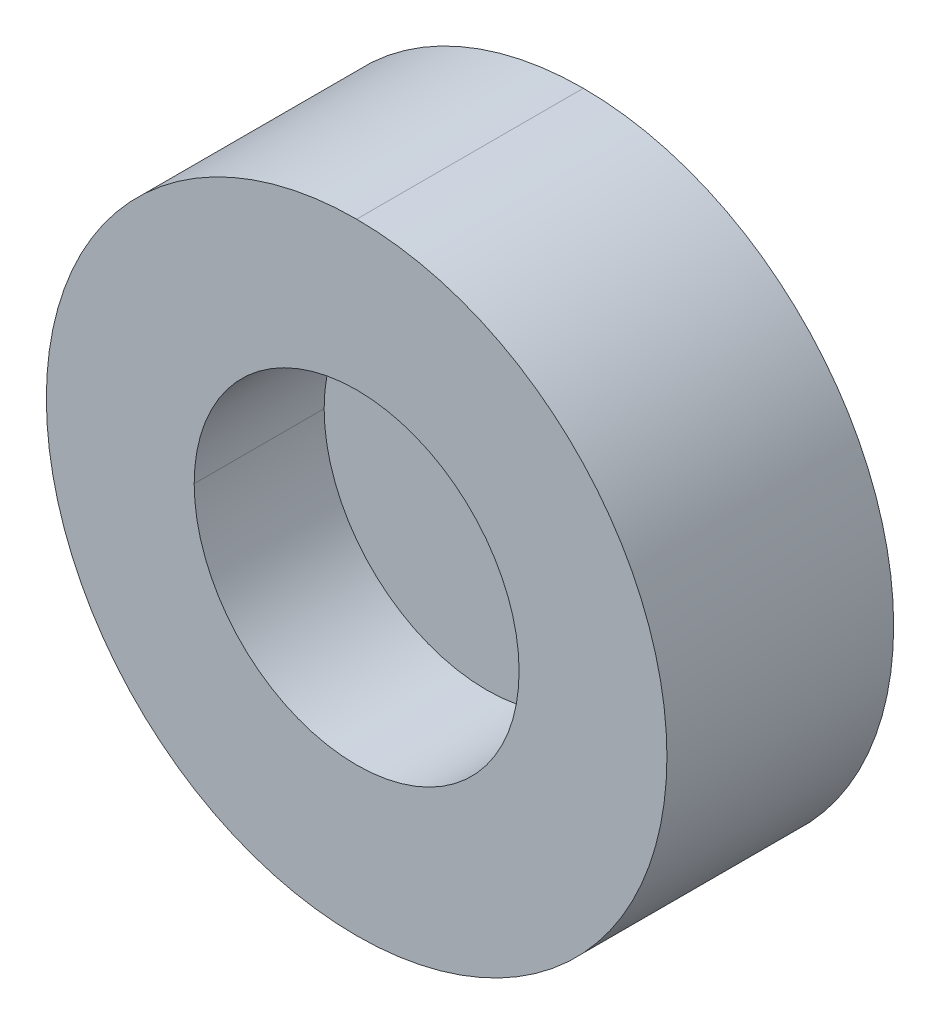
ISO-10303-21;
HEADER;
FILE_DESCRIPTION(('STEP AP214'),'2;1');
FILE_NAME('part.step','',(''),(''),'','','');
FILE_SCHEMA(('AUTOMOTIVE_DESIGN { 1 0 10303 214 1 1 1 1 }'));
ENDSEC;
DATA;
#1=APPLICATION_CONTEXT('core data for automotive mechanical design processes');
#2=APPLICATION_PROTOCOL_DEFINITION('international standard','automotive_design',2000,#1);
#3=PRODUCT_CONTEXT('',#1,'mechanical');
#4=PRODUCT('Part','Part','',(#3));
#5=PRODUCT_RELATED_PRODUCT_CATEGORY('part','',(#4));
#6=PRODUCT_DEFINITION_FORMATION('','',#4);
#7=PRODUCT_DEFINITION_CONTEXT('part definition',#1,'design');
#8=PRODUCT_DEFINITION('design','',#6,#7);
#9=PRODUCT_DEFINITION_SHAPE('','',#8);
#10=(LENGTH_UNIT() NAMED_UNIT(*) SI_UNIT(.MILLI.,.METRE.));
#11=(NAMED_UNIT(*) PLANE_ANGLE_UNIT() SI_UNIT($,.RADIAN.));
#12=(NAMED_UNIT(*) SI_UNIT($,.STERADIAN.) SOLID_ANGLE_UNIT());
#13=UNCERTAINTY_MEASURE_WITH_UNIT(LENGTH_MEASURE(1.E-05),#10,'distance_accuracy_value','');
#14=(GEOMETRIC_REPRESENTATION_CONTEXT(3) GLOBAL_UNCERTAINTY_ASSIGNED_CONTEXT((#13)) GLOBAL_UNIT_ASSIGNED_CONTEXT((#10,
#11,#12)) REPRESENTATION_CONTEXT('',''));
#15=CARTESIAN_POINT('',(0.,0.,0.));
#16=DIRECTION('',(0.,0.,1.));
#17=DIRECTION('',(1.,0.,0.));
#18=AXIS2_PLACEMENT_3D('',#15,#16,#17);
#19=CARTESIAN_POINT('',(0.,0.,0.));
#20=DIRECTION('',(0.,0.,-1.));
#21=DIRECTION('',(0.,-1.,0.));
#22=AXIS2_PLACEMENT_3D('',#19,#20,#21);
#23=PLANE('',#22);
#24=CARTESIAN_POINT('',(0.,0.,0.));
#25=DIRECTION('',(0.,0.,-1.));
#26=DIRECTION('',(0.,1.,0.));
#27=AXIS2_PLACEMENT_3D('',#24,#25,#26);
#28=CIRCLE('',#27,47.75);
#29=CARTESIAN_POINT('',(0.,47.75,0.));
#30=VERTEX_POINT('',#29);
#31=CARTESIAN_POINT('',(0.,-47.75,0.));
#32=VERTEX_POINT('',#31);
#33=EDGE_CURVE('E41',#30,#32,#28,.T.);
#34=ORIENTED_EDGE('',*,*,#33,.F.);
#35=CARTESIAN_POINT('',(0.,0.,0.));
#36=DIRECTION('',(0.,0.,-1.));
#37=DIRECTION('',(0.,-1.,0.));
#38=AXIS2_PLACEMENT_3D('',#35,#36,#37);
#39=CIRCLE('',#38,47.75);
#40=EDGE_CURVE('E21',#32,#30,#39,.T.);
#41=ORIENTED_EDGE('',*,*,#40,.F.);
#42=EDGE_LOOP('',(#34,#41));
#43=FACE_BOUND('',#42,.T.);
#44=CARTESIAN_POINT('',(0.,0.,0.));
#45=DIRECTION('',(0.,0.,-1.));
#46=DIRECTION('',(1.,0.,0.));
#47=AXIS2_PLACEMENT_3D('',#44,#45,#46);
#48=CIRCLE('',#47,25.);
#49=CARTESIAN_POINT('',(25.,0.,0.));
#50=VERTEX_POINT('',#49);
#51=CARTESIAN_POINT('',(-25.,0.,0.));
#52=VERTEX_POINT('',#51);
#53=EDGE_CURVE('E11',#50,#52,#48,.T.);
#54=ORIENTED_EDGE('',*,*,#53,.T.);
#55=CARTESIAN_POINT('',(0.,0.,0.));
#56=DIRECTION('',(0.,0.,-1.));
#57=DIRECTION('',(-1.,0.,0.));
#58=AXIS2_PLACEMENT_3D('',#55,#56,#57);
#59=CIRCLE('',#58,25.);
#60=EDGE_CURVE('E28',#52,#50,#59,.T.);
#61=ORIENTED_EDGE('',*,*,#60,.T.);
#62=EDGE_LOOP('',(#54,#61));
#63=FACE_BOUND('',#62,.T.);
#64=ADVANCED_FACE('F17',(#43,#63),#23,.F.);
#65=CARTESIAN_POINT('',(0.,0.,0.));
#66=DIRECTION('',(0.,0.,-1.));
#67=DIRECTION('',(0.,-1.,0.));
#68=AXIS2_PLACEMENT_3D('',#65,#66,#67);
#69=CYLINDRICAL_SURFACE('',#68,47.75);
#70=DIRECTION('',(0.,0.,-1.));
#71=VECTOR('',#70,1.);
#72=CARTESIAN_POINT('',(0.,47.75,0.));
#73=LINE('',#72,#71);
#74=CARTESIAN_POINT('',(0.,47.75,-34.889255818715));
#75=VERTEX_POINT('',#74);
#76=EDGE_CURVE('E102',#30,#75,#73,.T.);
#77=ORIENTED_EDGE('',*,*,#76,.T.);
#78=CARTESIAN_POINT('',(0.,0.,-34.889255818715));
#79=DIRECTION('',(0.,0.,-1.));
#80=DIRECTION('',(0.,-1.,0.));
#81=AXIS2_PLACEMENT_3D('',#78,#79,#80);
#82=CIRCLE('',#81,47.75);
#83=CARTESIAN_POINT('',(0.,-47.75,-34.889255818715));
#84=VERTEX_POINT('',#83);
#85=EDGE_CURVE('E63',#84,#75,#82,.T.);
#86=ORIENTED_EDGE('',*,*,#85,.F.);
#87=DIRECTION('',(0.,0.,-1.));
#88=VECTOR('',#87,1.);
#89=CARTESIAN_POINT('',(0.,-47.75,0.));
#90=LINE('',#89,#88);
#91=EDGE_CURVE('E113',#32,#84,#90,.T.);
#92=ORIENTED_EDGE('',*,*,#91,.F.);
#93=ORIENTED_EDGE('',*,*,#40,.T.);
#94=EDGE_LOOP('',(#77,#86,#92,#93));
#95=FACE_BOUND('',#94,.T.);
#96=ADVANCED_FACE('F121',(#95),#69,.T.);
#97=CARTESIAN_POINT('',(0.,0.,0.));
#98=DIRECTION('',(0.,0.,-1.));
#99=DIRECTION('',(0.,-1.,0.));
#100=AXIS2_PLACEMENT_3D('',#97,#98,#99);
#101=CYLINDRICAL_SURFACE('',#100,47.75);
#102=ORIENTED_EDGE('',*,*,#91,.T.);
#103=CARTESIAN_POINT('',(0.,0.,-34.889255818715));
#104=DIRECTION('',(0.,0.,-1.));
#105=DIRECTION('',(0.,1.,0.));
#106=AXIS2_PLACEMENT_3D('',#103,#104,#105);
#107=CIRCLE('',#106,47.75);
#108=EDGE_CURVE('E104',#75,#84,#107,.T.);
#109=ORIENTED_EDGE('',*,*,#108,.F.);
#110=ORIENTED_EDGE('',*,*,#76,.F.);
#111=ORIENTED_EDGE('',*,*,#33,.T.);
#112=EDGE_LOOP('',(#102,#109,#110,#111));
#113=FACE_BOUND('',#112,.T.);
#114=ADVANCED_FACE('F19',(#113),#101,.T.);
#115=CARTESIAN_POINT('',(0.,0.,-34.889255818715));
#116=DIRECTION('',(0.,0.,-1.));
#117=DIRECTION('',(0.,-1.,0.));
#118=AXIS2_PLACEMENT_3D('',#115,#116,#117);
#119=PLANE('',#118);
#120=ORIENTED_EDGE('',*,*,#108,.T.);
#121=ORIENTED_EDGE('',*,*,#85,.T.);
#122=EDGE_LOOP('',(#120,#121));
#123=FACE_BOUND('',#122,.T.);
#124=ADVANCED_FACE('F122',(#123),#119,.T.);
#125=CARTESIAN_POINT('',(0.,0.,0.));
#126=DIRECTION('',(0.,0.,-1.));
#127=DIRECTION('',(-1.,0.,0.));
#128=AXIS2_PLACEMENT_3D('',#125,#126,#127);
#129=CYLINDRICAL_SURFACE('',#128,25.);
#130=CARTESIAN_POINT('',(0.,0.,-20.));
#131=DIRECTION('',(0.,0.,-1.));
#132=DIRECTION('',(-1.,0.,0.));
#133=AXIS2_PLACEMENT_3D('',#130,#131,#132);
#134=CIRCLE('',#133,25.);
#135=CARTESIAN_POINT('',(-25.,0.,-20.));
#136=VERTEX_POINT('',#135);
#137=CARTESIAN_POINT('',(25.,0.,-20.));
#138=VERTEX_POINT('',#137);
#139=EDGE_CURVE('E87',#136,#138,#134,.T.);
#140=ORIENTED_EDGE('',*,*,#139,.T.);
#141=DIRECTION('',(0.,0.,-1.));
#142=VECTOR('',#141,1.);
#143=CARTESIAN_POINT('',(25.,0.,0.));
#144=LINE('',#143,#142);
#145=EDGE_CURVE('E78',#50,#138,#144,.T.);
#146=ORIENTED_EDGE('',*,*,#145,.F.);
#147=ORIENTED_EDGE('',*,*,#60,.F.);
#148=DIRECTION('',(0.,0.,-1.));
#149=VECTOR('',#148,1.);
#150=CARTESIAN_POINT('',(-25.,0.,0.));
#151=LINE('',#150,#149);
#152=EDGE_CURVE('E84',#52,#136,#151,.T.);
#153=ORIENTED_EDGE('',*,*,#152,.T.);
#154=EDGE_LOOP('',(#140,#146,#147,#153));
#155=FACE_BOUND('',#154,.T.);
#156=ADVANCED_FACE('F86',(#155),#129,.F.);
#157=CARTESIAN_POINT('',(0.,0.,0.));
#158=DIRECTION('',(0.,0.,-1.));
#159=DIRECTION('',(-1.,0.,0.));
#160=AXIS2_PLACEMENT_3D('',#157,#158,#159);
#161=CYLINDRICAL_SURFACE('',#160,25.);
#162=ORIENTED_EDGE('',*,*,#53,.F.);
#163=ORIENTED_EDGE('',*,*,#145,.T.);
#164=CARTESIAN_POINT('',(0.,0.,-20.));
#165=DIRECTION('',(0.,0.,-1.));
#166=DIRECTION('',(1.,0.,0.));
#167=AXIS2_PLACEMENT_3D('',#164,#165,#166);
#168=CIRCLE('',#167,25.);
#169=EDGE_CURVE('E93',#138,#136,#168,.T.);
#170=ORIENTED_EDGE('',*,*,#169,.T.);
#171=ORIENTED_EDGE('',*,*,#152,.F.);
#172=EDGE_LOOP('',(#162,#163,#170,#171));
#173=FACE_BOUND('',#172,.T.);
#174=ADVANCED_FACE('F96',(#173),#161,.F.);
#175=CARTESIAN_POINT('',(0.,0.,-20.));
#176=DIRECTION('',(0.,0.,-1.));
#177=DIRECTION('',(0.,-1.,0.));
#178=AXIS2_PLACEMENT_3D('',#175,#176,#177);
#179=PLANE('',#178);
#180=ORIENTED_EDGE('',*,*,#169,.F.);
#181=ORIENTED_EDGE('',*,*,#139,.F.);
#182=EDGE_LOOP('',(#180,#181));
#183=FACE_BOUND('',#182,.T.);
#184=ADVANCED_FACE('F92',(#183),#179,.F.);
#185=CLOSED_SHELL('',(#64,#96,#114,#124,#156,#174,#184));
#186=MANIFOLD_SOLID_BREP('B1',#185);
#187=ADVANCED_BREP_SHAPE_REPRESENTATION('',(#18,#186),#14);
#188=SHAPE_DEFINITION_REPRESENTATION(#9,#187);
ENDSEC;
END-ISO-10303-21;
